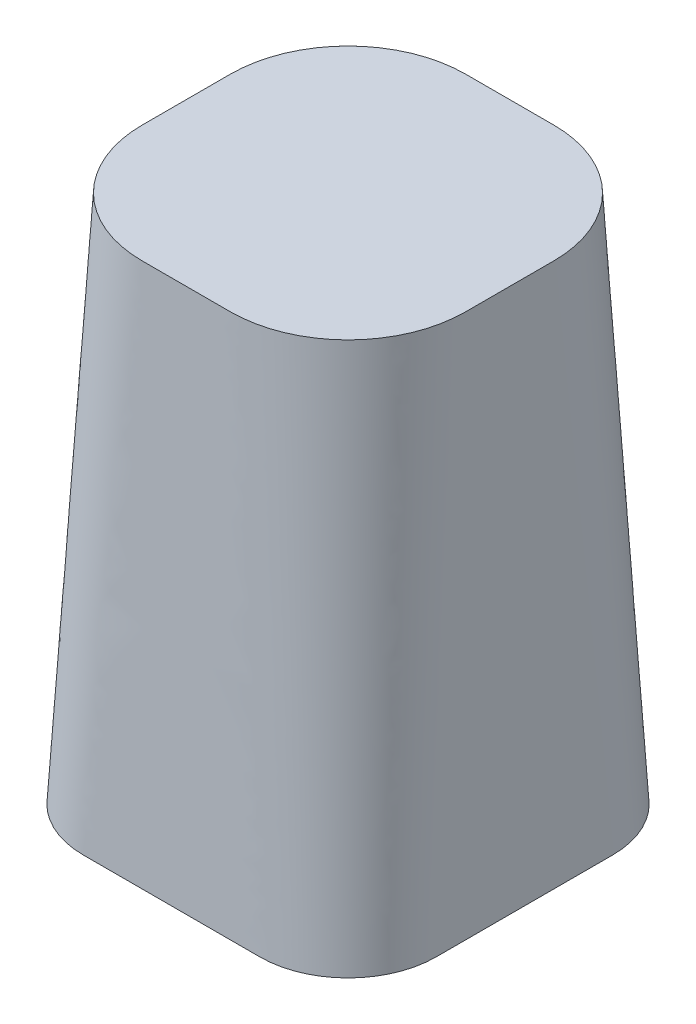
ISO-10303-21;
HEADER;
FILE_DESCRIPTION(('STEP AP214'),'2;1');
FILE_NAME('part.step','',(''),(''),'','','');
FILE_SCHEMA(('AUTOMOTIVE_DESIGN { 1 0 10303 214 1 1 1 1 }'));
ENDSEC;
DATA;
#1=APPLICATION_CONTEXT('core data for automotive mechanical design processes');
#2=APPLICATION_PROTOCOL_DEFINITION('international standard','automotive_design',2000,#1);
#3=PRODUCT_CONTEXT('',#1,'mechanical');
#4=PRODUCT('Part','Part','',(#3));
#5=PRODUCT_RELATED_PRODUCT_CATEGORY('part','',(#4));
#6=PRODUCT_DEFINITION_FORMATION('','',#4);
#7=PRODUCT_DEFINITION_CONTEXT('part definition',#1,'design');
#8=PRODUCT_DEFINITION('design','',#6,#7);
#9=PRODUCT_DEFINITION_SHAPE('','',#8);
#10=(LENGTH_UNIT() NAMED_UNIT(*) SI_UNIT(.MILLI.,.METRE.));
#11=(NAMED_UNIT(*) PLANE_ANGLE_UNIT() SI_UNIT($,.RADIAN.));
#12=(NAMED_UNIT(*) SI_UNIT($,.STERADIAN.) SOLID_ANGLE_UNIT());
#13=UNCERTAINTY_MEASURE_WITH_UNIT(LENGTH_MEASURE(1.E-05),#10,'distance_accuracy_value','');
#14=(GEOMETRIC_REPRESENTATION_CONTEXT(3) GLOBAL_UNCERTAINTY_ASSIGNED_CONTEXT((#13)) GLOBAL_UNIT_ASSIGNED_CONTEXT((#10,
#11,#12)) REPRESENTATION_CONTEXT('',''));
#15=CARTESIAN_POINT('',(0.,0.,0.));
#16=DIRECTION('',(0.,0.,1.));
#17=DIRECTION('',(1.,0.,0.));
#18=AXIS2_PLACEMENT_3D('',#15,#16,#17);
#19=CARTESIAN_POINT('',(-1.5,18.,1.5));
#20=DIRECTION('',(0.,1.,0.));
#21=DIRECTION('',(0.,0.,1.));
#22=AXIS2_PLACEMENT_3D('',#19,#20,#21);
#23=PLANE('',#22);
#24=DIRECTION('',(0.,0.,1.));
#25=VECTOR('',#24,1.);
#26=CARTESIAN_POINT('',(-5.5,18.,-1.49999999999997));
#27=LINE('',#26,#25);
#28=CARTESIAN_POINT('',(-5.5,18.,-1.49999999999997));
#29=VERTEX_POINT('',#28);
#30=CARTESIAN_POINT('',(-5.5,18.,1.50000000003463));
#31=VERTEX_POINT('',#30);
#32=EDGE_CURVE('E421',#29,#31,#27,.T.);
#33=ORIENTED_EDGE('',*,*,#32,.T.);
#34=CARTESIAN_POINT('',(-1.5,18.,1.5));
#35=DIRECTION('',(0.,1.,0.));
#36=DIRECTION('',(0.,0.,1.));
#37=AXIS2_PLACEMENT_3D('',#34,#35,#36);
#38=CIRCLE('',#37,4.);
#39=CARTESIAN_POINT('',(-1.49999999991228,18.,5.5));
#40=VERTEX_POINT('',#39);
#41=EDGE_CURVE('E537',#31,#40,#38,.T.);
#42=ORIENTED_EDGE('',*,*,#41,.T.);
#43=DIRECTION('',(1.,0.,0.));
#44=VECTOR('',#43,1.);
#45=CARTESIAN_POINT('',(-1.49999999999997,18.,5.5));
#46=LINE('',#45,#44);
#47=CARTESIAN_POINT('',(1.50000000000079,18.,5.5));
#48=VERTEX_POINT('',#47);
#49=EDGE_CURVE('E529',#40,#48,#46,.T.);
#50=ORIENTED_EDGE('',*,*,#49,.T.);
#51=CARTESIAN_POINT('',(1.5,18.,1.5));
#52=DIRECTION('',(0.,1.,0.));
#53=DIRECTION('',(0.,0.,1.));
#54=AXIS2_PLACEMENT_3D('',#51,#52,#53);
#55=CIRCLE('',#54,4.);
#56=CARTESIAN_POINT('',(5.5,18.,1.49999999999933));
#57=VERTEX_POINT('',#56);
#58=EDGE_CURVE('E522',#48,#57,#55,.T.);
#59=ORIENTED_EDGE('',*,*,#58,.T.);
#60=DIRECTION('',(0.,0.,1.));
#61=VECTOR('',#60,1.);
#62=CARTESIAN_POINT('',(5.5,18.,-1.49999999999997));
#63=LINE('',#62,#61);
#64=CARTESIAN_POINT('',(5.5,18.,-1.50000000003492));
#65=VERTEX_POINT('',#64);
#66=EDGE_CURVE('E515',#65,#57,#63,.T.);
#67=ORIENTED_EDGE('',*,*,#66,.F.);
#68=CARTESIAN_POINT('',(1.5,18.,-1.5));
#69=DIRECTION('',(0.,1.,0.));
#70=DIRECTION('',(0.,0.,1.));
#71=AXIS2_PLACEMENT_3D('',#68,#69,#70);
#72=CIRCLE('',#71,4.);
#73=CARTESIAN_POINT('',(1.49999999991235,18.,-5.5));
#74=VERTEX_POINT('',#73);
#75=EDGE_CURVE('E507',#65,#74,#72,.T.);
#76=ORIENTED_EDGE('',*,*,#75,.T.);
#77=DIRECTION('',(1.,0.,0.));
#78=VECTOR('',#77,1.);
#79=CARTESIAN_POINT('',(-1.49999999999997,18.,-5.5));
#80=LINE('',#79,#78);
#81=CARTESIAN_POINT('',(-1.49999999999997,18.,-5.5));
#82=VERTEX_POINT('',#81);
#83=EDGE_CURVE('E242',#82,#74,#80,.T.);
#84=ORIENTED_EDGE('',*,*,#83,.F.);
#85=CARTESIAN_POINT('',(-1.5,18.,-1.5));
#86=DIRECTION('',(0.,1.,0.));
#87=DIRECTION('',(0.,0.,1.));
#88=AXIS2_PLACEMENT_3D('',#85,#86,#87);
#89=CIRCLE('',#88,4.);
#90=EDGE_CURVE('E12',#82,#29,#89,.T.);
#91=ORIENTED_EDGE('',*,*,#90,.T.);
#92=EDGE_LOOP('',(#33,#42,#50,#59,#67,#76,#84,#91));
#93=FACE_BOUND('',#92,.T.);
#94=ADVANCED_FACE('F231',(#93),#23,.T.);
#95=CARTESIAN_POINT('',(-3.,0.,3.));
#96=DIRECTION('',(0.,1.,0.));
#97=DIRECTION('',(0.,0.,1.));
#98=AXIS2_PLACEMENT_3D('',#95,#96,#97);
#99=PLANE('',#98);
#100=DIRECTION('',(0.,0.,1.));
#101=VECTOR('',#100,1.);
#102=CARTESIAN_POINT('',(-6.,0.,-2.99999999999998));
#103=LINE('',#102,#101);
#104=CARTESIAN_POINT('',(-6.,0.,-2.99999999999998));
#105=VERTEX_POINT('',#104);
#106=CARTESIAN_POINT('',(-6.,0.,2.99999999999998));
#107=VERTEX_POINT('',#106);
#108=EDGE_CURVE('E303',#105,#107,#103,.T.);
#109=ORIENTED_EDGE('',*,*,#108,.F.);
#110=CARTESIAN_POINT('',(-3.,0.,-3.));
#111=DIRECTION('',(0.,1.,0.));
#112=DIRECTION('',(0.,0.,1.));
#113=AXIS2_PLACEMENT_3D('',#110,#111,#112);
#114=CIRCLE('',#113,3.);
#115=CARTESIAN_POINT('',(-2.99999999999998,0.,-6.));
#116=VERTEX_POINT('',#115);
#117=EDGE_CURVE('E312',#116,#105,#114,.T.);
#118=ORIENTED_EDGE('',*,*,#117,.F.);
#119=DIRECTION('',(1.,0.,0.));
#120=VECTOR('',#119,1.);
#121=CARTESIAN_POINT('',(-2.99999999999998,0.,-6.));
#122=LINE('',#121,#120);
#123=CARTESIAN_POINT('',(2.99999999999998,0.,-6.));
#124=VERTEX_POINT('',#123);
#125=EDGE_CURVE('E427',#116,#124,#122,.T.);
#126=ORIENTED_EDGE('',*,*,#125,.T.);
#127=CARTESIAN_POINT('',(3.,0.,-3.));
#128=DIRECTION('',(0.,1.,0.));
#129=DIRECTION('',(0.,0.,1.));
#130=AXIS2_PLACEMENT_3D('',#127,#128,#129);
#131=CIRCLE('',#130,3.);
#132=CARTESIAN_POINT('',(6.,0.,-2.99999999999998));
#133=VERTEX_POINT('',#132);
#134=EDGE_CURVE('E441',#133,#124,#131,.T.);
#135=ORIENTED_EDGE('',*,*,#134,.F.);
#136=DIRECTION('',(0.,0.,1.));
#137=VECTOR('',#136,1.);
#138=CARTESIAN_POINT('',(6.,0.,-2.99999999999998));
#139=LINE('',#138,#137);
#140=CARTESIAN_POINT('',(6.,0.,2.99999999999998));
#141=VERTEX_POINT('',#140);
#142=EDGE_CURVE('E446',#133,#141,#139,.T.);
#143=ORIENTED_EDGE('',*,*,#142,.T.);
#144=CARTESIAN_POINT('',(3.,0.,3.));
#145=DIRECTION('',(0.,1.,0.));
#146=DIRECTION('',(0.,0.,1.));
#147=AXIS2_PLACEMENT_3D('',#144,#145,#146);
#148=CIRCLE('',#147,3.);
#149=CARTESIAN_POINT('',(2.99999999999998,0.,6.));
#150=VERTEX_POINT('',#149);
#151=EDGE_CURVE('E461',#150,#141,#148,.T.);
#152=ORIENTED_EDGE('',*,*,#151,.F.);
#153=DIRECTION('',(1.,0.,0.));
#154=VECTOR('',#153,1.);
#155=CARTESIAN_POINT('',(-2.99999999999998,0.,6.));
#156=LINE('',#155,#154);
#157=CARTESIAN_POINT('',(-3.,0.,6.));
#158=VERTEX_POINT('',#157);
#159=EDGE_CURVE('E305',#158,#150,#156,.T.);
#160=ORIENTED_EDGE('',*,*,#159,.F.);
#161=CARTESIAN_POINT('',(-3.,0.,3.));
#162=DIRECTION('',(0.,1.,0.));
#163=DIRECTION('',(0.,0.,1.));
#164=AXIS2_PLACEMENT_3D('',#161,#162,#163);
#165=CIRCLE('',#164,3.);
#166=EDGE_CURVE('E300',#107,#158,#165,.T.);
#167=ORIENTED_EDGE('',*,*,#166,.F.);
#168=EDGE_LOOP('',(#109,#118,#126,#135,#143,#152,#160,#167));
#169=FACE_BOUND('',#168,.T.);
#170=ADVANCED_FACE('F296',(#169),#99,.F.);
#171=CARTESIAN_POINT('',(-2.99999999900646,0.,6.));
#172=CARTESIAN_POINT('',(-1.49999999913901,18.,5.5));
#173=CARTESIAN_POINT('',(-2.60575547850882,0.,6.));
#174=CARTESIAN_POINT('',(-1.15835399031491,18.,5.5));
#175=CARTESIAN_POINT('',(-1.72239739192376,0.,6.));
#176=CARTESIAN_POINT('',(-0.666515722457862,18.,5.50000000000001));
#177=CARTESIAN_POINT('',(0.,0.,6.));
#178=CARTESIAN_POINT('',(0.,18.,5.49999999999999));
#179=CARTESIAN_POINT('',(1.72239739192374,0.,6.));
#180=CARTESIAN_POINT('',(0.666515722457832,18.,5.50000000000001));
#181=CARTESIAN_POINT('',(2.6057554785088,0.,6.));
#182=CARTESIAN_POINT('',(1.15835399031488,18.,5.5));
#183=CARTESIAN_POINT('',(3.24922727848212,0.,6.));
#184=CARTESIAN_POINT('',(1.7159763815513,18.,5.5));
#185=CARTESIAN_POINT('',(3.68760747591042,0.,5.94115983213422));
#186=CARTESIAN_POINT('',(2.17172989569275,18.,5.46516449746812));
#187=CARTESIAN_POINT('',(4.24463173323359,0.,5.74931777864886));
#188=CARTESIAN_POINT('',(2.9100303710839,18.,5.27165380241784));
#189=CARTESIAN_POINT('',(4.72245866453258,0.,5.47561351597254));
#190=CARTESIAN_POINT('',(3.66083608994381,18.,4.90301004547463));
#191=CARTESIAN_POINT('',(5.1325021470794,0.,5.13250214707939));
#192=CARTESIAN_POINT('',(4.35177789970283,18.,4.35177789970283));
#193=CARTESIAN_POINT('',(5.47561351597254,0.,4.72245866453259));
#194=CARTESIAN_POINT('',(4.90301004547463,18.,3.66083608994381));
#195=CARTESIAN_POINT('',(5.74931777864886,0.,4.24463173323359));
#196=CARTESIAN_POINT('',(5.27165380241785,18.,2.9100303710839));
#197=CARTESIAN_POINT('',(5.94115983213422,0.,3.68760747591043));
#198=CARTESIAN_POINT('',(5.46516449746811,18.,2.17172989569274));
#199=CARTESIAN_POINT('',(6.,0.,3.24922727848212));
#200=CARTESIAN_POINT('',(5.5,18.,1.7159763815513));
#201=CARTESIAN_POINT('',(6.,0.,2.6057554785088));
#202=CARTESIAN_POINT('',(5.5,18.,1.15835399031488));
#203=CARTESIAN_POINT('',(6.,0.,1.72239739192374));
#204=CARTESIAN_POINT('',(5.5,18.,0.666515722457842));
#205=CARTESIAN_POINT('',(5.99999999999999,0.,0.));
#206=CARTESIAN_POINT('',(5.49999999999999,18.,0.));
#207=CARTESIAN_POINT('',(6.,0.,-1.72239739192375));
#208=CARTESIAN_POINT('',(5.50000000000001,18.,-0.66651572245784));
#209=CARTESIAN_POINT('',(6.,0.,-2.6057554785088));
#210=CARTESIAN_POINT('',(5.5,18.,-1.15835399031488));
#211=CARTESIAN_POINT('',(6.,0.,-3.24922727848213));
#212=CARTESIAN_POINT('',(5.5,18.,-1.7159763815513));
#213=CARTESIAN_POINT('',(5.94115983213422,0.,-3.68760747591043));
#214=CARTESIAN_POINT('',(5.4651644974681,18.,-2.17172989569274));
#215=CARTESIAN_POINT('',(5.74931777864886,0.,-4.24463173323359));
#216=CARTESIAN_POINT('',(5.27165380241785,18.,-2.91003037108389));
#217=CARTESIAN_POINT('',(5.47561351597255,0.,-4.72245866453259));
#218=CARTESIAN_POINT('',(4.90301004547463,18.,-3.66083608994382));
#219=CARTESIAN_POINT('',(5.13250214707938,0.,-5.13250214707938));
#220=CARTESIAN_POINT('',(4.35177789970284,18.,-4.35177789970282));
#221=CARTESIAN_POINT('',(4.72245866453259,0.,-5.47561351597255));
#222=CARTESIAN_POINT('',(3.66083608994382,18.,-4.90301004547463));
#223=CARTESIAN_POINT('',(4.24463173323359,0.,-5.74931777864886));
#224=CARTESIAN_POINT('',(2.91003037108389,18.,-5.27165380241784));
#225=CARTESIAN_POINT('',(3.68760747591043,0.,-5.94115983213422));
#226=CARTESIAN_POINT('',(2.17172989569275,18.,-5.46516449746811));
#227=CARTESIAN_POINT('',(3.24922727848213,0.,-6.));
#228=CARTESIAN_POINT('',(1.7159763815513,18.,-5.5));
#229=CARTESIAN_POINT('',(2.6057554785088,0.,-6.));
#230=CARTESIAN_POINT('',(1.15835399031489,18.,-5.5));
#231=CARTESIAN_POINT('',(1.72239739192375,0.,-6.));
#232=CARTESIAN_POINT('',(0.666515722457842,18.,-5.50000000000001));
#233=CARTESIAN_POINT('',(0.,0.,-5.99999999999999));
#234=CARTESIAN_POINT('',(0.,18.,-5.5));
#235=CARTESIAN_POINT('',(-1.72239739192375,0.,-6.));
#236=CARTESIAN_POINT('',(-0.666515722457837,18.,-5.5));
#237=CARTESIAN_POINT('',(-2.6057554785088,0.,-6.));
#238=CARTESIAN_POINT('',(-1.15835399031488,18.,-5.5));
#239=CARTESIAN_POINT('',(-3.24922727848212,0.,-6.));
#240=CARTESIAN_POINT('',(-1.7159763815513,18.,-5.5));
#241=CARTESIAN_POINT('',(-3.68760747591043,0.,-5.94115983213422));
#242=CARTESIAN_POINT('',(-2.17172989569274,18.,-5.46516449746811));
#243=CARTESIAN_POINT('',(-4.24463173323359,0.,-5.74931777864885));
#244=CARTESIAN_POINT('',(-2.91003037108389,18.,-5.27165380241784));
#245=CARTESIAN_POINT('',(-4.72245866453259,0.,-5.47561351597256));
#246=CARTESIAN_POINT('',(-3.6608360899438,18.,-4.90301004547463));
#247=CARTESIAN_POINT('',(-5.13250214707938,0.,-5.13250214707938));
#248=CARTESIAN_POINT('',(-4.35177789970283,18.,-4.35177789970284));
#249=CARTESIAN_POINT('',(-5.47561351597255,0.,-4.72245866453259));
#250=CARTESIAN_POINT('',(-4.90301004547462,18.,-3.66083608994382));
#251=CARTESIAN_POINT('',(-5.74931777864886,0.,-4.24463173323358));
#252=CARTESIAN_POINT('',(-5.27165380241785,18.,-2.9100303710839));
#253=CARTESIAN_POINT('',(-5.94115983213422,0.,-3.68760747591043));
#254=CARTESIAN_POINT('',(-5.4651644974681,18.,-2.17172989569274));
#255=CARTESIAN_POINT('',(-6.,0.,-3.24922727848212));
#256=CARTESIAN_POINT('',(-5.5,18.,-1.7159763815513));
#257=CARTESIAN_POINT('',(-6.,0.,-2.6057554785088));
#258=CARTESIAN_POINT('',(-5.5,18.,-1.15835399031489));
#259=CARTESIAN_POINT('',(-5.99999999999999,0.,-1.72239739192374));
#260=CARTESIAN_POINT('',(-5.50000000000001,18.,-0.666515722457842));
#261=CARTESIAN_POINT('',(-6.00000000000001,0.,0.));
#262=CARTESIAN_POINT('',(-5.49999999999999,18.,0.));
#263=CARTESIAN_POINT('',(-5.99999999999999,0.,1.72239739192374));
#264=CARTESIAN_POINT('',(-5.5,18.,0.666515722457839));
#265=CARTESIAN_POINT('',(-6.,0.,2.6057554785088));
#266=CARTESIAN_POINT('',(-5.5,18.,1.15835399031488));
#267=CARTESIAN_POINT('',(-6.,0.,3.24922727848212));
#268=CARTESIAN_POINT('',(-5.5,18.,1.7159763815513));
#269=CARTESIAN_POINT('',(-5.94115983213421,0.,3.68760747591042));
#270=CARTESIAN_POINT('',(-5.46516449746811,18.,2.17172989569274));
#271=CARTESIAN_POINT('',(-5.74931777864887,0.,4.2446317332336));
#272=CARTESIAN_POINT('',(-5.27165380241784,18.,2.91003037108389));
#273=CARTESIAN_POINT('',(-5.47561351597255,0.,4.72245866453257));
#274=CARTESIAN_POINT('',(-4.90301004547464,18.,3.6608360899438));
#275=CARTESIAN_POINT('',(-5.13250214707939,0.,5.13250214707939));
#276=CARTESIAN_POINT('',(-4.35177789970285,18.,4.35177789970282));
#277=CARTESIAN_POINT('',(-4.7224586645326,0.,5.47561351597253));
#278=CARTESIAN_POINT('',(-3.66083608994383,18.,4.90301004547462));
#279=CARTESIAN_POINT('',(-4.24463173323361,0.,5.74931777864885));
#280=CARTESIAN_POINT('',(-2.91003037108392,17.9999999999999,5.27165380241784));
#281=CARTESIAN_POINT('',(-3.68760747591045,0.,5.94115983213421));
#282=CARTESIAN_POINT('',(-2.17172989569277,18.,5.4651644974681));
#283=CARTESIAN_POINT('',(-3.24922727848215,0.,6.));
#284=CARTESIAN_POINT('',(-1.71597638155133,18.,5.5));
#285=CARTESIAN_POINT('',(-2.99999999900646,0.,6.));
#286=CARTESIAN_POINT('',(-1.49999999913901,18.,5.5));
#287=B_SPLINE_SURFACE_WITH_KNOTS('',3,1,((#171,#172),(#173,#174),(#175,#176),(#177,#178),(#179,
#180),(#181,#182),(#183,#184),(#185,#186),(#187,#188),(#189,#190),(#191,#192),(#193,#194),(#195,
#196),(#197,#198),(#199,#200),(#201,#202),(#203,#204),(#205,#206),(#207,#208),(#209,#210),(#211,
#212),(#213,#214),(#215,#216),(#217,#218),(#219,#220),(#221,#222),(#223,#224),(#225,#226),(#227,
#228),(#229,#230),(#231,#232),(#233,#234),(#235,#236),(#237,#238),(#239,#240),(#241,#242),(#243,
#244),(#245,#246),(#247,#248),(#249,#250),(#251,#252),(#253,#254),(#255,#256),(#257,#258),(#259,
#260),(#261,#262),(#263,#264),(#265,#266),(#267,#268),(#269,#270),(#271,#272),(#273,#274),(#275,
#276),(#277,#278),(#279,#280),(#281,#282),(#283,#284),(#285,#286)),.UNSPECIFIED.,.T.,.F.,.F.,(4,
1,1,1,2,1,1,1,1,1,1,1,2,1,1,1,2,1,1,1,1,1,1,1,2,1,1,1,2,1,1,1,1,1,1,1,2,1,1,1,2,1,1,1,1,1,1,1,
4),(2,2),(0.,0.0276020028454723,0.0552040056909446,0.0828060085364169,0.110408011381889,
0.127857009959153,0.145306008536417,0.162755007113681,0.180204005690945,0.197653004268209,
0.215102002845473,0.232551001422737,0.250000000000001,0.277602002845473,0.305204005690945,
0.332806008536417,0.360408011381889,0.377857009959153,0.395306008536417,0.412755007113681,
0.430204005690945,0.447653004268209,0.465102002845473,0.482551001422737,0.500000000000001,
0.527602002845473,0.555204005690945,0.582806008536417,0.610408011381889,0.627857009959153,
0.645306008536417,0.662755007113681,0.680204005690945,0.697653004268209,0.715102002845473,
0.732551001422737,0.750000000000001,0.777602002845473,0.805204005690945,0.832806008536417,
0.860408011381889,0.877857009959153,0.895306008536417,0.912755007113681,0.930204005690945,
0.947653004268209,0.965102002845472,0.982551001422736,1.),(0.,1.),.UNSPECIFIED.);
#288=CARTESIAN_POINT('',(-6.,0.,0.));
#289=CARTESIAN_POINT('',(-5.5,18.,0.));
#290=CARTESIAN_POINT('',(-6.,0.,0.574132463974581));
#291=CARTESIAN_POINT('',(-5.5,18.,0.222171907485944));
#292=CARTESIAN_POINT('',(-5.99999999999999,0.,1.72239739192374));
#293=CARTESIAN_POINT('',(-5.5,18.,0.666515722457839));
#294=CARTESIAN_POINT('',(-6.,0.,2.6057554785088));
#295=CARTESIAN_POINT('',(-5.5,18.,1.15835399031488));
#296=CARTESIAN_POINT('',(-6.,0.,3.24922727848212));
#297=CARTESIAN_POINT('',(-5.5,18.,1.7159763815513));
#298=CARTESIAN_POINT('',(-5.94115983213421,0.,3.68760747591042));
#299=CARTESIAN_POINT('',(-5.46516449746811,18.,2.17172989569274));
#300=CARTESIAN_POINT('',(-5.74931777864887,0.,4.2446317332336));
#301=CARTESIAN_POINT('',(-5.27165380241784,18.,2.91003037108389));
#302=CARTESIAN_POINT('',(-5.47561351597255,0.,4.72245866453257));
#303=CARTESIAN_POINT('',(-4.90301004547464,18.,3.6608360899438));
#304=CARTESIAN_POINT('',(-5.13250214707939,0.,5.13250214707939));
#305=CARTESIAN_POINT('',(-4.35177789970285,18.,4.35177789970282));
#306=CARTESIAN_POINT('',(-4.7224586645326,0.,5.47561351597253));
#307=CARTESIAN_POINT('',(-3.66083608994383,18.,4.90301004547462));
#308=CARTESIAN_POINT('',(-4.24463173323361,0.,5.74931777864885));
#309=CARTESIAN_POINT('',(-2.91003037108392,17.9999999999999,5.27165380241784));
#310=CARTESIAN_POINT('',(-3.68760747591045,0.,5.94115983213421));
#311=CARTESIAN_POINT('',(-2.17172989569277,18.,5.4651644974681));
#312=CARTESIAN_POINT('',(-3.24922727848215,0.,6.));
#313=CARTESIAN_POINT('',(-1.71597638155133,18.,5.5));
#314=CARTESIAN_POINT('',(-2.60575547850882,0.,6.));
#315=CARTESIAN_POINT('',(-1.15835399031491,18.,5.5));
#316=CARTESIAN_POINT('',(-1.72239739192376,0.,6.));
#317=CARTESIAN_POINT('',(-0.666515722457862,18.,5.50000000000001));
#318=CARTESIAN_POINT('',(0.,0.,6.));
#319=CARTESIAN_POINT('',(0.,18.,5.49999999999999));
#320=CARTESIAN_POINT('',(1.72239739192374,0.,6.));
#321=CARTESIAN_POINT('',(0.666515722457832,18.,5.50000000000001));
#322=CARTESIAN_POINT('',(2.6057554785088,0.,6.));
#323=CARTESIAN_POINT('',(1.15835399031488,18.,5.5));
#324=CARTESIAN_POINT('',(3.24922727848212,0.,6.));
#325=CARTESIAN_POINT('',(1.7159763815513,18.,5.5));
#326=CARTESIAN_POINT('',(3.68760747591042,0.,5.94115983213422));
#327=CARTESIAN_POINT('',(2.17172989569275,18.,5.46516449746812));
#328=CARTESIAN_POINT('',(4.24463173323359,0.,5.74931777864886));
#329=CARTESIAN_POINT('',(2.9100303710839,18.,5.27165380241784));
#330=CARTESIAN_POINT('',(4.72245866453258,0.,5.47561351597254));
#331=CARTESIAN_POINT('',(3.66083608994381,18.,4.90301004547463));
#332=CARTESIAN_POINT('',(5.1325021470794,0.,5.13250214707939));
#333=CARTESIAN_POINT('',(4.35177789970283,18.,4.35177789970283));
#334=CARTESIAN_POINT('',(5.47561351597254,0.,4.72245866453259));
#335=CARTESIAN_POINT('',(4.90301004547463,18.,3.66083608994381));
#336=CARTESIAN_POINT('',(5.74931777864886,0.,4.24463173323359));
#337=CARTESIAN_POINT('',(5.27165380241785,18.,2.9100303710839));
#338=CARTESIAN_POINT('',(5.94115983213422,0.,3.68760747591043));
#339=CARTESIAN_POINT('',(5.46516449746811,18.,2.17172989569274));
#340=CARTESIAN_POINT('',(6.,0.,3.24922727848212));
#341=CARTESIAN_POINT('',(5.5,18.,1.7159763815513));
#342=CARTESIAN_POINT('',(6.,0.,2.6057554785088));
#343=CARTESIAN_POINT('',(5.5,18.,1.15835399031488));
#344=CARTESIAN_POINT('',(6.,0.,1.72239739192374));
#345=CARTESIAN_POINT('',(5.5,18.,0.666515722457842));
#346=CARTESIAN_POINT('',(5.99999999999999,0.,0.));
#347=CARTESIAN_POINT('',(5.49999999999999,18.,0.));
#348=CARTESIAN_POINT('',(6.,0.,-1.72239739192375));
#349=CARTESIAN_POINT('',(5.50000000000001,18.,-0.66651572245784));
#350=CARTESIAN_POINT('',(6.,0.,-2.6057554785088));
#351=CARTESIAN_POINT('',(5.5,18.,-1.15835399031488));
#352=CARTESIAN_POINT('',(6.,0.,-3.24922727848213));
#353=CARTESIAN_POINT('',(5.5,18.,-1.7159763815513));
#354=CARTESIAN_POINT('',(5.94115983213422,0.,-3.68760747591043));
#355=CARTESIAN_POINT('',(5.4651644974681,18.,-2.17172989569274));
#356=CARTESIAN_POINT('',(5.74931777864886,0.,-4.24463173323359));
#357=CARTESIAN_POINT('',(5.27165380241785,18.,-2.91003037108389));
#358=CARTESIAN_POINT('',(5.47561351597255,0.,-4.72245866453259));
#359=CARTESIAN_POINT('',(4.90301004547463,18.,-3.66083608994382));
#360=CARTESIAN_POINT('',(5.13250214707938,0.,-5.13250214707938));
#361=CARTESIAN_POINT('',(4.35177789970284,18.,-4.35177789970282));
#362=CARTESIAN_POINT('',(4.72245866453259,0.,-5.47561351597255));
#363=CARTESIAN_POINT('',(3.66083608994382,18.,-4.90301004547463));
#364=CARTESIAN_POINT('',(4.24463173323359,0.,-5.74931777864886));
#365=CARTESIAN_POINT('',(2.91003037108389,18.,-5.27165380241784));
#366=CARTESIAN_POINT('',(3.68760747591043,0.,-5.94115983213422));
#367=CARTESIAN_POINT('',(2.17172989569275,18.,-5.46516449746811));
#368=CARTESIAN_POINT('',(3.24922727848213,0.,-6.));
#369=CARTESIAN_POINT('',(1.7159763815513,18.,-5.5));
#370=CARTESIAN_POINT('',(2.6057554785088,0.,-6.));
#371=CARTESIAN_POINT('',(1.15835399031489,18.,-5.5));
#372=CARTESIAN_POINT('',(1.72239739192375,0.,-6.));
#373=CARTESIAN_POINT('',(0.666515722457842,18.,-5.50000000000001));
#374=CARTESIAN_POINT('',(0.,0.,-5.99999999999999));
#375=CARTESIAN_POINT('',(0.,18.,-5.5));
#376=CARTESIAN_POINT('',(-1.72239739192375,0.,-6.));
#377=CARTESIAN_POINT('',(-0.666515722457837,18.,-5.5));
#378=CARTESIAN_POINT('',(-2.6057554785088,0.,-6.));
#379=CARTESIAN_POINT('',(-1.15835399031488,18.,-5.5));
#380=CARTESIAN_POINT('',(-3.24922727848212,0.,-6.));
#381=CARTESIAN_POINT('',(-1.7159763815513,18.,-5.5));
#382=CARTESIAN_POINT('',(-3.68760747591043,0.,-5.94115983213422));
#383=CARTESIAN_POINT('',(-2.17172989569274,18.,-5.46516449746811));
#384=CARTESIAN_POINT('',(-4.24463173323359,0.,-5.74931777864885));
#385=CARTESIAN_POINT('',(-2.91003037108389,18.,-5.27165380241784));
#386=CARTESIAN_POINT('',(-4.72245866453259,0.,-5.47561351597256));
#387=CARTESIAN_POINT('',(-3.6608360899438,18.,-4.90301004547463));
#388=CARTESIAN_POINT('',(-5.13250214707938,0.,-5.13250214707938));
#389=CARTESIAN_POINT('',(-4.35177789970283,18.,-4.35177789970284));
#390=CARTESIAN_POINT('',(-5.47561351597255,0.,-4.72245866453259));
#391=CARTESIAN_POINT('',(-4.90301004547462,18.,-3.66083608994382));
#392=CARTESIAN_POINT('',(-5.74931777864886,0.,-4.24463173323358));
#393=CARTESIAN_POINT('',(-5.27165380241785,18.,-2.9100303710839));
#394=CARTESIAN_POINT('',(-5.94115983213422,0.,-3.68760747591043));
#395=CARTESIAN_POINT('',(-5.4651644974681,18.,-2.17172989569274));
#396=CARTESIAN_POINT('',(-6.,0.,-3.24922727848212));
#397=CARTESIAN_POINT('',(-5.5,18.,-1.7159763815513));
#398=CARTESIAN_POINT('',(-6.,0.,-2.6057554785088));
#399=CARTESIAN_POINT('',(-5.5,18.,-1.15835399031489));
#400=CARTESIAN_POINT('',(-5.99999999999999,0.,-1.72239739192374));
#401=CARTESIAN_POINT('',(-5.50000000000001,18.,-0.666515722457842));
#402=CARTESIAN_POINT('',(-6.,0.,-0.574132463974581));
#403=CARTESIAN_POINT('',(-5.5,18.,-0.22217190748595));
#404=CARTESIAN_POINT('',(-6.,0.,0.));
#405=CARTESIAN_POINT('',(-5.5,18.,0.));
#406=B_SPLINE_SURFACE_WITH_KNOTS('',3,1,((#288,#289),(#290,#291),(#292,#293),(#294,#295),(#296,
#297),(#298,#299),(#300,#301),(#302,#303),(#304,#305),(#306,#307),(#308,#309),(#310,#311),(#312,
#313),(#314,#315),(#316,#317),(#318,#319),(#320,#321),(#322,#323),(#324,#325),(#326,#327),(#328,
#329),(#330,#331),(#332,#333),(#334,#335),(#336,#337),(#338,#339),(#340,#341),(#342,#343),(#344,
#345),(#346,#347),(#348,#349),(#350,#351),(#352,#353),(#354,#355),(#356,#357),(#358,#359),(#360,
#361),(#362,#363),(#364,#365),(#366,#367),(#368,#369),(#370,#371),(#372,#373),(#374,#375),(#376,
#377),(#378,#379),(#380,#381),(#382,#383),(#384,#385),(#386,#387),(#388,#389),(#390,#391),(#392,
#393),(#394,#395),(#396,#397),(#398,#399),(#400,#401),(#402,#403),(#404,#405)),.UNSPECIFIED.,
.T.,.F.,.F.,(4,1,2,1,1,1,1,1,1,1,2,1,1,1,2,1,1,1,1,1,1,1,2,1,1,1,2,1,1,1,1,1,1,1,2,1,1,1,2,1,1,
1,1,1,1,1,2,1,4),(2,2),(0.805204005690945,0.832806008536417,0.860408011381889,0.877857009959153,
0.895306008536417,0.912755007113681,0.930204005690945,0.947653004268209,0.965102002845472,
0.982551001422736,1.,1.02760200284547,1.05520400569094,1.08280600853642,1.11040801138189,
1.12785700995915,1.14530600853642,1.16275500711368,1.18020400569094,1.19765300426821,
1.21510200284547,1.23255100142274,1.25,1.27760200284547,1.30520400569094,1.33280600853642,
1.36040801138189,1.37785700995915,1.39530600853642,1.41275500711368,1.43020400569095,
1.44765300426821,1.46510200284547,1.48255100142274,1.5,1.52760200284547,1.55520400569095,
1.58280600853642,1.61040801138189,1.62785700995915,1.64530600853642,1.66275500711368,
1.68020400569094,1.69765300426821,1.71510200284547,1.73255100142274,1.75,1.77760200284547,
1.80520400569095),(0.,1.),.UNSPECIFIED.);
#407=ORIENTED_EDGE('',*,*,#117,.T.);
#408=ORIENTED_EDGE('',*,*,#108,.T.);
#409=ORIENTED_EDGE('',*,*,#166,.T.);
#410=ORIENTED_EDGE('',*,*,#159,.T.);
#411=ORIENTED_EDGE('',*,*,#151,.T.);
#412=ORIENTED_EDGE('',*,*,#142,.F.);
#413=ORIENTED_EDGE('',*,*,#134,.T.);
#414=ORIENTED_EDGE('',*,*,#125,.F.);
#415=EDGE_LOOP('',(#407,#408,#409,#410,#411,#412,#413,#414));
#416=FACE_BOUND('',#415,.T.);
#417=ORIENTED_EDGE('',*,*,#83,.T.);
#418=ORIENTED_EDGE('',*,*,#75,.F.);
#419=ORIENTED_EDGE('',*,*,#66,.T.);
#420=ORIENTED_EDGE('',*,*,#58,.F.);
#421=ORIENTED_EDGE('',*,*,#49,.F.);
#422=ORIENTED_EDGE('',*,*,#41,.F.);
#423=ORIENTED_EDGE('',*,*,#32,.F.);
#424=ORIENTED_EDGE('',*,*,#90,.F.);
#425=EDGE_LOOP('',(#417,#418,#419,#420,#421,#422,#423,#424));
#426=FACE_BOUND('',#425,.T.);
#427=ADVANCED_FACE('F315',(#416,#426),#406,.T.);
#428=CLOSED_SHELL('',(#94,#170,#427));
#429=MANIFOLD_SOLID_BREP('B2',#428);
#430=ADVANCED_BREP_SHAPE_REPRESENTATION('',(#18,#429),#14);
#431=SHAPE_DEFINITION_REPRESENTATION(#9,#430);
ENDSEC;
END-ISO-10303-21;
